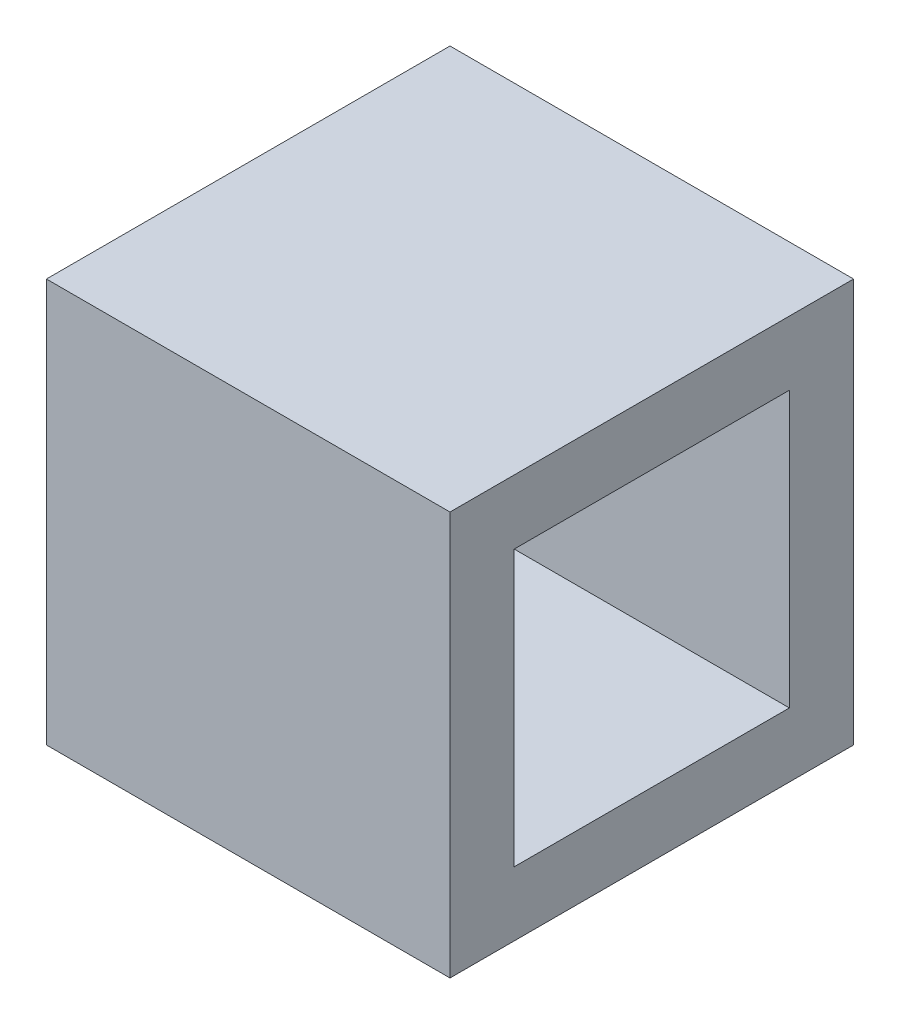
ISO-10303-21;
HEADER;
FILE_DESCRIPTION(('STEP AP214'),'2;1');
FILE_NAME('part.step','',(''),(''),'','','');
FILE_SCHEMA(('AUTOMOTIVE_DESIGN { 1 0 10303 214 1 1 1 1 }'));
ENDSEC;
DATA;
#1=APPLICATION_CONTEXT('core data for automotive mechanical design processes');
#2=APPLICATION_PROTOCOL_DEFINITION('international standard','automotive_design',2000,#1);
#3=PRODUCT_CONTEXT('',#1,'mechanical');
#4=PRODUCT('Part','Part','',(#3));
#5=PRODUCT_RELATED_PRODUCT_CATEGORY('part','',(#4));
#6=PRODUCT_DEFINITION_FORMATION('','',#4);
#7=PRODUCT_DEFINITION_CONTEXT('part definition',#1,'design');
#8=PRODUCT_DEFINITION('design','',#6,#7);
#9=PRODUCT_DEFINITION_SHAPE('','',#8);
#10=(LENGTH_UNIT() NAMED_UNIT(*) SI_UNIT(.MILLI.,.METRE.));
#11=(NAMED_UNIT(*) PLANE_ANGLE_UNIT() SI_UNIT($,.RADIAN.));
#12=(NAMED_UNIT(*) SI_UNIT($,.STERADIAN.) SOLID_ANGLE_UNIT());
#13=UNCERTAINTY_MEASURE_WITH_UNIT(LENGTH_MEASURE(1.E-05),#10,'distance_accuracy_value','');
#14=(GEOMETRIC_REPRESENTATION_CONTEXT(3) GLOBAL_UNCERTAINTY_ASSIGNED_CONTEXT((#13)) GLOBAL_UNIT_ASSIGNED_CONTEXT((#10,
#11,#12)) REPRESENTATION_CONTEXT('',''));
#15=CARTESIAN_POINT('',(0.,0.,0.));
#16=DIRECTION('',(0.,0.,1.));
#17=DIRECTION('',(1.,0.,0.));
#18=AXIS2_PLACEMENT_3D('',#15,#16,#17);
#19=CARTESIAN_POINT('',(24.5588926090329,1.46676786933757,22.));
#20=DIRECTION('',(1.,0.,0.));
#21=DIRECTION('',(0.,1.,0.));
#22=AXIS2_PLACEMENT_3D('',#19,#20,#21);
#23=PLANE('',#22);
#24=DIRECTION('',(0.,-1.,0.));
#25=VECTOR('',#24,1.);
#26=CARTESIAN_POINT('',(24.5588926090329,1.46676786933757,0.));
#27=LINE('',#26,#25);
#28=CARTESIAN_POINT('',(24.5588926090329,1.46676786933757,0.));
#29=VERTEX_POINT('',#28);
#30=CARTESIAN_POINT('',(24.5588926090329,-20.5332321306624,0.));
#31=VERTEX_POINT('',#30);
#32=EDGE_CURVE('E141',#29,#31,#27,.T.);
#33=ORIENTED_EDGE('',*,*,#32,.T.);
#34=DIRECTION('',(0.,0.,-1.));
#35=VECTOR('',#34,1.);
#36=CARTESIAN_POINT('',(24.5588926090329,-20.5332321306624,22.));
#37=LINE('',#36,#35);
#38=CARTESIAN_POINT('',(24.5588926090329,-20.5332321306624,22.));
#39=VERTEX_POINT('',#38);
#40=EDGE_CURVE('E12',#39,#31,#37,.T.);
#41=ORIENTED_EDGE('',*,*,#40,.F.);
#42=DIRECTION('',(0.,-1.,0.));
#43=VECTOR('',#42,1.);
#44=CARTESIAN_POINT('',(24.5588926090329,1.46676786933757,22.));
#45=LINE('',#44,#43);
#46=CARTESIAN_POINT('',(24.5588926090329,1.46676786933757,22.));
#47=VERTEX_POINT('',#46);
#48=EDGE_CURVE('E143',#47,#39,#45,.T.);
#49=ORIENTED_EDGE('',*,*,#48,.F.);
#50=DIRECTION('',(0.,0.,-1.));
#51=VECTOR('',#50,1.);
#52=CARTESIAN_POINT('',(24.5588926090329,1.46676786933757,22.));
#53=LINE('',#52,#51);
#54=EDGE_CURVE('E149',#47,#29,#53,.T.);
#55=ORIENTED_EDGE('',*,*,#54,.T.);
#56=EDGE_LOOP('',(#33,#41,#49,#55));
#57=FACE_BOUND('',#56,.T.);
#58=ADVANCED_FACE('F34',(#57),#23,.F.);
#59=CARTESIAN_POINT('',(24.5588926090329,-20.5332321306624,22.));
#60=DIRECTION('',(0.,1.,0.));
#61=DIRECTION('',(0.,0.,1.));
#62=AXIS2_PLACEMENT_3D('',#59,#60,#61);
#63=PLANE('',#62);
#64=DIRECTION('',(1.,0.,0.));
#65=VECTOR('',#64,1.);
#66=CARTESIAN_POINT('',(24.5588926090329,-20.5332321306624,0.));
#67=LINE('',#66,#65);
#68=CARTESIAN_POINT('',(46.5588926090329,-20.5332321306624,0.));
#69=VERTEX_POINT('',#68);
#70=EDGE_CURVE('E152',#31,#69,#67,.T.);
#71=ORIENTED_EDGE('',*,*,#70,.T.);
#72=DIRECTION('',(0.,0.,-1.));
#73=VECTOR('',#72,1.);
#74=CARTESIAN_POINT('',(46.5588926090329,-20.5332321306624,22.));
#75=LINE('',#74,#73);
#76=CARTESIAN_POINT('',(46.5588926090329,-20.5332321306624,22.));
#77=VERTEX_POINT('',#76);
#78=EDGE_CURVE('E41',#77,#69,#75,.T.);
#79=ORIENTED_EDGE('',*,*,#78,.F.);
#80=DIRECTION('',(1.,0.,0.));
#81=VECTOR('',#80,1.);
#82=CARTESIAN_POINT('',(24.5588926090329,-20.5332321306624,22.));
#83=LINE('',#82,#81);
#84=EDGE_CURVE('E85',#39,#77,#83,.T.);
#85=ORIENTED_EDGE('',*,*,#84,.F.);
#86=ORIENTED_EDGE('',*,*,#40,.T.);
#87=EDGE_LOOP('',(#71,#79,#85,#86));
#88=FACE_BOUND('',#87,.T.);
#89=ADVANCED_FACE('F178',(#88),#63,.F.);
#90=CARTESIAN_POINT('',(46.5588926090329,1.46676786933757,22.));
#91=DIRECTION('',(-1.,0.,0.));
#92=DIRECTION('',(0.,-1.,0.));
#93=AXIS2_PLACEMENT_3D('',#90,#91,#92);
#94=PLANE('',#93);
#95=DIRECTION('',(0.,0.,-1.));
#96=VECTOR('',#95,1.);
#97=CARTESIAN_POINT('',(46.5588926090329,-17.0332321306624,18.5));
#98=LINE('',#97,#96);
#99=CARTESIAN_POINT('',(46.5588926090329,-17.0332321306624,18.5));
#100=VERTEX_POINT('',#99);
#101=CARTESIAN_POINT('',(46.5588926090329,-17.0332321306624,3.5));
#102=VERTEX_POINT('',#101);
#103=EDGE_CURVE('E123',#100,#102,#98,.T.);
#104=ORIENTED_EDGE('',*,*,#103,.F.);
#105=DIRECTION('',(0.,-1.,0.));
#106=VECTOR('',#105,1.);
#107=CARTESIAN_POINT('',(46.5588926090329,-2.03323213066243,18.5));
#108=LINE('',#107,#106);
#109=CARTESIAN_POINT('',(46.5588926090329,-2.03323213066243,18.5));
#110=VERTEX_POINT('',#109);
#111=EDGE_CURVE('E48',#110,#100,#108,.T.);
#112=ORIENTED_EDGE('',*,*,#111,.F.);
#113=DIRECTION('',(0.,0.,1.));
#114=VECTOR('',#113,1.);
#115=CARTESIAN_POINT('',(46.5588926090329,-2.03323213066243,18.5));
#116=LINE('',#115,#114);
#117=CARTESIAN_POINT('',(46.5588926090329,-2.03323213066243,3.5));
#118=VERTEX_POINT('',#117);
#119=EDGE_CURVE('E130',#118,#110,#116,.T.);
#120=ORIENTED_EDGE('',*,*,#119,.F.);
#121=DIRECTION('',(0.,1.,0.));
#122=VECTOR('',#121,1.);
#123=CARTESIAN_POINT('',(46.5588926090329,-2.03323213066243,3.5));
#124=LINE('',#123,#122);
#125=EDGE_CURVE('E113',#102,#118,#124,.T.);
#126=ORIENTED_EDGE('',*,*,#125,.F.);
#127=EDGE_LOOP('',(#104,#112,#120,#126));
#128=FACE_BOUND('',#127,.T.);
#129=DIRECTION('',(0.,1.,0.));
#130=VECTOR('',#129,1.);
#131=CARTESIAN_POINT('',(46.5588926090329,1.46676786933757,0.));
#132=LINE('',#131,#130);
#133=CARTESIAN_POINT('',(46.5588926090329,1.46676786933757,0.));
#134=VERTEX_POINT('',#133);
#135=EDGE_CURVE('E154',#69,#134,#132,.T.);
#136=ORIENTED_EDGE('',*,*,#135,.T.);
#137=DIRECTION('',(0.,0.,-1.));
#138=VECTOR('',#137,1.);
#139=CARTESIAN_POINT('',(46.5588926090329,1.46676786933757,22.));
#140=LINE('',#139,#138);
#141=CARTESIAN_POINT('',(46.5588926090329,1.46676786933757,22.));
#142=VERTEX_POINT('',#141);
#143=EDGE_CURVE('E158',#142,#134,#140,.T.);
#144=ORIENTED_EDGE('',*,*,#143,.F.);
#145=DIRECTION('',(0.,1.,0.));
#146=VECTOR('',#145,1.);
#147=CARTESIAN_POINT('',(46.5588926090329,1.46676786933757,22.));
#148=LINE('',#147,#146);
#149=EDGE_CURVE('E146',#77,#142,#148,.T.);
#150=ORIENTED_EDGE('',*,*,#149,.F.);
#151=ORIENTED_EDGE('',*,*,#78,.T.);
#152=EDGE_LOOP('',(#136,#144,#150,#151));
#153=FACE_BOUND('',#152,.T.);
#154=ADVANCED_FACE('F127',(#128,#153),#94,.F.);
#155=CARTESIAN_POINT('',(24.5588926090329,1.46676786933757,22.));
#156=DIRECTION('',(0.,-1.,0.));
#157=DIRECTION('',(0.,0.,-1.));
#158=AXIS2_PLACEMENT_3D('',#155,#156,#157);
#159=PLANE('',#158);
#160=DIRECTION('',(-1.,0.,0.));
#161=VECTOR('',#160,1.);
#162=CARTESIAN_POINT('',(24.5588926090329,1.46676786933757,0.));
#163=LINE('',#162,#161);
#164=EDGE_CURVE('E78',#134,#29,#163,.T.);
#165=ORIENTED_EDGE('',*,*,#164,.T.);
#166=ORIENTED_EDGE('',*,*,#54,.F.);
#167=DIRECTION('',(-1.,0.,0.));
#168=VECTOR('',#167,1.);
#169=CARTESIAN_POINT('',(24.5588926090329,1.46676786933757,22.));
#170=LINE('',#169,#168);
#171=EDGE_CURVE('E57',#142,#47,#170,.T.);
#172=ORIENTED_EDGE('',*,*,#171,.F.);
#173=ORIENTED_EDGE('',*,*,#143,.T.);
#174=EDGE_LOOP('',(#165,#166,#172,#173));
#175=FACE_BOUND('',#174,.T.);
#176=ADVANCED_FACE('F169',(#175),#159,.F.);
#177=CARTESIAN_POINT('',(0.,0.,22.));
#178=DIRECTION('',(0.,0.,1.));
#179=DIRECTION('',(1.,0.,0.));
#180=AXIS2_PLACEMENT_3D('',#177,#178,#179);
#181=PLANE('',#180);
#182=ORIENTED_EDGE('',*,*,#48,.T.);
#183=ORIENTED_EDGE('',*,*,#84,.T.);
#184=ORIENTED_EDGE('',*,*,#149,.T.);
#185=ORIENTED_EDGE('',*,*,#171,.T.);
#186=EDGE_LOOP('',(#182,#183,#184,#185));
#187=FACE_BOUND('',#186,.T.);
#188=ADVANCED_FACE('F171',(#187),#181,.T.);
#189=CARTESIAN_POINT('',(0.,0.,0.));
#190=DIRECTION('',(0.,0.,1.));
#191=DIRECTION('',(1.,0.,0.));
#192=AXIS2_PLACEMENT_3D('',#189,#190,#191);
#193=PLANE('',#192);
#194=ORIENTED_EDGE('',*,*,#32,.F.);
#195=ORIENTED_EDGE('',*,*,#164,.F.);
#196=ORIENTED_EDGE('',*,*,#135,.F.);
#197=ORIENTED_EDGE('',*,*,#70,.F.);
#198=EDGE_LOOP('',(#194,#195,#196,#197));
#199=FACE_BOUND('',#198,.T.);
#200=ADVANCED_FACE('F165',(#199),#193,.F.);
#201=CARTESIAN_POINT('',(3.34568917343649,-2.03323213066241,18.5));
#202=DIRECTION('',(0.,0.,1.));
#203=DIRECTION('',(0.,-1.,0.));
#204=AXIS2_PLACEMENT_3D('',#201,#202,#203);
#205=PLANE('',#204);
#206=DIRECTION('',(0.,1.,0.));
#207=VECTOR('',#206,1.);
#208=CARTESIAN_POINT('',(28.0588926090329,-2.03323213066241,18.5));
#209=LINE('',#208,#207);
#210=CARTESIAN_POINT('',(28.0588926090329,-17.0332321306624,18.5));
#211=VERTEX_POINT('',#210);
#212=CARTESIAN_POINT('',(28.0588926090329,-2.03323213066242,18.5));
#213=VERTEX_POINT('',#212);
#214=EDGE_CURVE('E142',#211,#213,#209,.T.);
#215=ORIENTED_EDGE('',*,*,#214,.T.);
#216=DIRECTION('',(1.,0.,0.));
#217=VECTOR('',#216,1.);
#218=CARTESIAN_POINT('',(3.34568917343649,-2.03323213066241,18.5));
#219=LINE('',#218,#217);
#220=EDGE_CURVE('E135',#213,#110,#219,.T.);
#221=ORIENTED_EDGE('',*,*,#220,.T.);
#222=ORIENTED_EDGE('',*,*,#111,.T.);
#223=DIRECTION('',(1.,0.,0.));
#224=VECTOR('',#223,1.);
#225=CARTESIAN_POINT('',(3.34568917343648,-17.0332321306624,18.5));
#226=LINE('',#225,#224);
#227=EDGE_CURVE('E120',#211,#100,#226,.T.);
#228=ORIENTED_EDGE('',*,*,#227,.F.);
#229=EDGE_LOOP('',(#215,#221,#222,#228));
#230=FACE_BOUND('',#229,.T.);
#231=ADVANCED_FACE('F202',(#230),#205,.F.);
#232=CARTESIAN_POINT('',(3.34568917343649,-2.03323213066241,18.5));
#233=DIRECTION('',(0.,1.,0.));
#234=DIRECTION('',(-1.,0.,0.));
#235=AXIS2_PLACEMENT_3D('',#232,#233,#234);
#236=PLANE('',#235);
#237=DIRECTION('',(0.,0.,-1.));
#238=VECTOR('',#237,1.);
#239=CARTESIAN_POINT('',(28.0588926090329,-2.03323213066242,18.5));
#240=LINE('',#239,#238);
#241=CARTESIAN_POINT('',(28.0588926090329,-2.03323213066241,3.5));
#242=VERTEX_POINT('',#241);
#243=EDGE_CURVE('E259',#213,#242,#240,.T.);
#244=ORIENTED_EDGE('',*,*,#243,.T.);
#245=DIRECTION('',(1.,0.,0.));
#246=VECTOR('',#245,1.);
#247=CARTESIAN_POINT('',(3.34568917343649,-2.03323213066241,3.5));
#248=LINE('',#247,#246);
#249=EDGE_CURVE('E119',#242,#118,#248,.T.);
#250=ORIENTED_EDGE('',*,*,#249,.T.);
#251=ORIENTED_EDGE('',*,*,#119,.T.);
#252=ORIENTED_EDGE('',*,*,#220,.F.);
#253=EDGE_LOOP('',(#244,#250,#251,#252));
#254=FACE_BOUND('',#253,.T.);
#255=ADVANCED_FACE('F207',(#254),#236,.F.);
#256=CARTESIAN_POINT('',(3.34568917343649,-2.03323213066241,3.5));
#257=DIRECTION('',(0.,0.,-1.));
#258=DIRECTION('',(0.,1.,0.));
#259=AXIS2_PLACEMENT_3D('',#256,#257,#258);
#260=PLANE('',#259);
#261=DIRECTION('',(0.,-1.,0.));
#262=VECTOR('',#261,1.);
#263=CARTESIAN_POINT('',(28.0588926090329,-2.03323213066241,3.5));
#264=LINE('',#263,#262);
#265=CARTESIAN_POINT('',(28.0588926090329,-17.0332321306624,3.5));
#266=VERTEX_POINT('',#265);
#267=EDGE_CURVE('E116',#242,#266,#264,.T.);
#268=ORIENTED_EDGE('',*,*,#267,.T.);
#269=DIRECTION('',(1.,0.,0.));
#270=VECTOR('',#269,1.);
#271=CARTESIAN_POINT('',(3.34568917343648,-17.0332321306624,3.5));
#272=LINE('',#271,#270);
#273=EDGE_CURVE('E108',#266,#102,#272,.T.);
#274=ORIENTED_EDGE('',*,*,#273,.T.);
#275=ORIENTED_EDGE('',*,*,#125,.T.);
#276=ORIENTED_EDGE('',*,*,#249,.F.);
#277=EDGE_LOOP('',(#268,#274,#275,#276));
#278=FACE_BOUND('',#277,.T.);
#279=ADVANCED_FACE('F110',(#278),#260,.F.);
#280=CARTESIAN_POINT('',(3.34568917343648,-17.0332321306624,18.5));
#281=DIRECTION('',(0.,-1.,0.));
#282=DIRECTION('',(1.,0.,0.));
#283=AXIS2_PLACEMENT_3D('',#280,#281,#282);
#284=PLANE('',#283);
#285=DIRECTION('',(0.,0.,1.));
#286=VECTOR('',#285,1.);
#287=CARTESIAN_POINT('',(28.0588926090329,-17.0332321306624,18.5));
#288=LINE('',#287,#286);
#289=EDGE_CURVE('E139',#266,#211,#288,.T.);
#290=ORIENTED_EDGE('',*,*,#289,.T.);
#291=ORIENTED_EDGE('',*,*,#227,.T.);
#292=ORIENTED_EDGE('',*,*,#103,.T.);
#293=ORIENTED_EDGE('',*,*,#273,.F.);
#294=EDGE_LOOP('',(#290,#291,#292,#293));
#295=FACE_BOUND('',#294,.T.);
#296=ADVANCED_FACE('F124',(#295),#284,.F.);
#297=CARTESIAN_POINT('',(28.0588926090329,1.46676786933758,22.));
#298=DIRECTION('',(1.,0.,0.));
#299=DIRECTION('',(0.,1.,0.));
#300=AXIS2_PLACEMENT_3D('',#297,#298,#299);
#301=PLANE('',#300);
#302=ORIENTED_EDGE('',*,*,#214,.F.);
#303=ORIENTED_EDGE('',*,*,#289,.F.);
#304=ORIENTED_EDGE('',*,*,#267,.F.);
#305=ORIENTED_EDGE('',*,*,#243,.F.);
#306=EDGE_LOOP('',(#302,#303,#304,#305));
#307=FACE_BOUND('',#306,.T.);
#308=ADVANCED_FACE('F233',(#307),#301,.T.);
#309=CLOSED_SHELL('',(#58,#89,#154,#176,#188,#200,#231,#255,#279,#296,#308));
#310=MANIFOLD_SOLID_BREP('B2',#309);
#311=ADVANCED_BREP_SHAPE_REPRESENTATION('',(#18,#310),#14);
#312=SHAPE_DEFINITION_REPRESENTATION(#9,#311);
ENDSEC;
END-ISO-10303-21;
